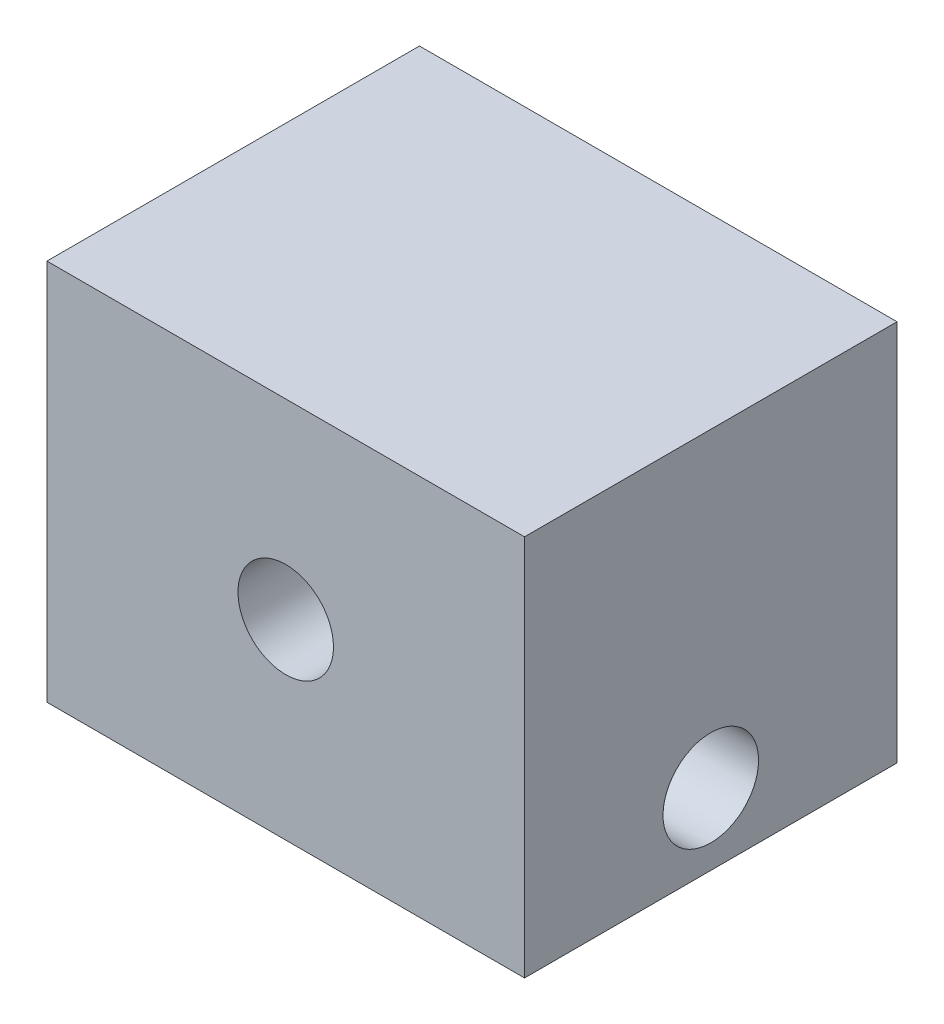
ISO-10303-21;
HEADER;
FILE_DESCRIPTION(('STEP AP214'),'2;1');
FILE_NAME('part.step','',(''),(''),'','','');
FILE_SCHEMA(('AUTOMOTIVE_DESIGN { 1 0 10303 214 1 1 1 1 }'));
ENDSEC;
DATA;
#1=APPLICATION_CONTEXT('core data for automotive mechanical design processes');
#2=APPLICATION_PROTOCOL_DEFINITION('international standard','automotive_design',2000,#1);
#3=PRODUCT_CONTEXT('',#1,'mechanical');
#4=PRODUCT('Part','Part','',(#3));
#5=PRODUCT_RELATED_PRODUCT_CATEGORY('part','',(#4));
#6=PRODUCT_DEFINITION_FORMATION('','',#4);
#7=PRODUCT_DEFINITION_CONTEXT('part definition',#1,'design');
#8=PRODUCT_DEFINITION('design','',#6,#7);
#9=PRODUCT_DEFINITION_SHAPE('','',#8);
#10=(LENGTH_UNIT() NAMED_UNIT(*) SI_UNIT(.MILLI.,.METRE.));
#11=(NAMED_UNIT(*) PLANE_ANGLE_UNIT() SI_UNIT($,.RADIAN.));
#12=(NAMED_UNIT(*) SI_UNIT($,.STERADIAN.) SOLID_ANGLE_UNIT());
#13=UNCERTAINTY_MEASURE_WITH_UNIT(LENGTH_MEASURE(1.E-05),#10,'distance_accuracy_value','');
#14=(GEOMETRIC_REPRESENTATION_CONTEXT(3) GLOBAL_UNCERTAINTY_ASSIGNED_CONTEXT((#13)) GLOBAL_UNIT_ASSIGNED_CONTEXT((#10,
#11,#12)) REPRESENTATION_CONTEXT('',''));
#15=CARTESIAN_POINT('',(0.,0.,0.));
#16=DIRECTION('',(0.,0.,1.));
#17=DIRECTION('',(1.,0.,0.));
#18=AXIS2_PLACEMENT_3D('',#15,#16,#17);
#19=CARTESIAN_POINT('',(-50.0000000000002,-25.0000000000004,-78.));
#20=DIRECTION('',(-1.,0.,0.));
#21=DIRECTION('',(0.,-1.,0.));
#22=AXIS2_PLACEMENT_3D('',#19,#20,#21);
#23=PLANE('',#22);
#24=CARTESIAN_POINT('',(-50.0000000000002,-9.99999999999998,-39.));
#25=DIRECTION('',(-1.,0.,0.));
#26=DIRECTION('',(0.,-1.,0.));
#27=AXIS2_PLACEMENT_3D('',#24,#25,#26);
#28=CIRCLE('',#27,10.);
#29=CARTESIAN_POINT('',(-50.0000000000001,-19.9999999999996,-39.));
#30=VERTEX_POINT('',#29);
#31=EDGE_CURVE('E180',#30,#30,#28,.T.);
#32=ORIENTED_EDGE('',*,*,#31,.F.);
#33=EDGE_LOOP('',(#32));
#34=FACE_BOUND('',#33,.T.);
#35=DIRECTION('',(0.,-1.,0.));
#36=VECTOR('',#35,1.);
#37=CARTESIAN_POINT('',(-50.0000000000002,-25.,0.));
#38=LINE('',#37,#36);
#39=CARTESIAN_POINT('',(-50.0000000000035,55.0000000000004,0.));
#40=VERTEX_POINT('',#39);
#41=CARTESIAN_POINT('',(-50.0000000000002,-25.,0.));
#42=VERTEX_POINT('',#41);
#43=EDGE_CURVE('E115',#40,#42,#38,.T.);
#44=ORIENTED_EDGE('',*,*,#43,.F.);
#45=DIRECTION('',(0.,0.,1.));
#46=VECTOR('',#45,1.);
#47=CARTESIAN_POINT('',(-50.0000000000035,55.0000000000004,-78.));
#48=LINE('',#47,#46);
#49=CARTESIAN_POINT('',(-50.0000000000035,55.0000000000004,-78.));
#50=VERTEX_POINT('',#49);
#51=EDGE_CURVE('E11',#50,#40,#48,.T.);
#52=ORIENTED_EDGE('',*,*,#51,.F.);
#53=DIRECTION('',(0.,-1.,0.));
#54=VECTOR('',#53,1.);
#55=CARTESIAN_POINT('',(-50.0000000000002,-25.0000000000004,-78.));
#56=LINE('',#55,#54);
#57=CARTESIAN_POINT('',(-50.0000000000002,-25.0000000000004,-78.));
#58=VERTEX_POINT('',#57);
#59=EDGE_CURVE('E103',#50,#58,#56,.T.);
#60=ORIENTED_EDGE('',*,*,#59,.T.);
#61=DIRECTION('',(0.,0.,1.));
#62=VECTOR('',#61,1.);
#63=CARTESIAN_POINT('',(-50.0000000000002,-25.0000000000004,-78.));
#64=LINE('',#63,#62);
#65=EDGE_CURVE('E44',#58,#42,#64,.T.);
#66=ORIENTED_EDGE('',*,*,#65,.T.);
#67=EDGE_LOOP('',(#44,#52,#60,#66));
#68=FACE_BOUND('',#67,.T.);
#69=ADVANCED_FACE('F41',(#34,#68),#23,.T.);
#70=CARTESIAN_POINT('',(-50.0000000000035,55.0000000000004,-78.));
#71=DIRECTION('',(0.,1.,0.));
#72=DIRECTION('',(-1.,0.,0.));
#73=AXIS2_PLACEMENT_3D('',#70,#71,#72);
#74=PLANE('',#73);
#75=DIRECTION('',(-1.,0.,0.));
#76=VECTOR('',#75,1.);
#77=CARTESIAN_POINT('',(-50.0000000000035,55.0000000000004,0.));
#78=LINE('',#77,#76);
#79=CARTESIAN_POINT('',(49.9999999999968,55.0000000000005,0.));
#80=VERTEX_POINT('',#79);
#81=EDGE_CURVE('E109',#80,#40,#78,.T.);
#82=ORIENTED_EDGE('',*,*,#81,.F.);
#83=DIRECTION('',(0.,0.,1.));
#84=VECTOR('',#83,1.);
#85=CARTESIAN_POINT('',(49.9999999999968,55.0000000000004,-78.));
#86=LINE('',#85,#84);
#87=CARTESIAN_POINT('',(49.9999999999968,55.0000000000004,-78.));
#88=VERTEX_POINT('',#87);
#89=EDGE_CURVE('E51',#88,#80,#86,.T.);
#90=ORIENTED_EDGE('',*,*,#89,.F.);
#91=DIRECTION('',(-1.,0.,0.));
#92=VECTOR('',#91,1.);
#93=CARTESIAN_POINT('',(-50.0000000000035,55.0000000000004,-78.));
#94=LINE('',#93,#92);
#95=EDGE_CURVE('E98',#88,#50,#94,.T.);
#96=ORIENTED_EDGE('',*,*,#95,.T.);
#97=ORIENTED_EDGE('',*,*,#51,.T.);
#98=EDGE_LOOP('',(#82,#90,#96,#97));
#99=FACE_BOUND('',#98,.T.);
#100=ADVANCED_FACE('F142',(#99),#74,.T.);
#101=CARTESIAN_POINT('',(49.9999999999968,55.0000000000004,-78.));
#102=DIRECTION('',(1.,0.,0.));
#103=DIRECTION('',(0.,1.,0.));
#104=AXIS2_PLACEMENT_3D('',#101,#102,#103);
#105=PLANE('',#104);
#106=CARTESIAN_POINT('',(50.0000000000002,-9.99999999999954,-39.));
#107=DIRECTION('',(1.,0.,0.));
#108=DIRECTION('',(0.,1.,0.));
#109=AXIS2_PLACEMENT_3D('',#106,#107,#108);
#110=CIRCLE('',#109,10.);
#111=CARTESIAN_POINT('',(50.0000000000002,-19.9999999999995,-39.));
#112=VERTEX_POINT('',#111);
#113=EDGE_CURVE('E177',#112,#112,#110,.F.);
#114=ORIENTED_EDGE('',*,*,#113,.T.);
#115=EDGE_LOOP('',(#114));
#116=FACE_BOUND('',#115,.T.);
#117=DIRECTION('',(0.,1.,0.));
#118=VECTOR('',#117,1.);
#119=CARTESIAN_POINT('',(49.9999999999968,55.0000000000005,0.));
#120=LINE('',#119,#118);
#121=CARTESIAN_POINT('',(50.0000000000002,-25.,0.));
#122=VERTEX_POINT('',#121);
#123=EDGE_CURVE('E92',#122,#80,#120,.T.);
#124=ORIENTED_EDGE('',*,*,#123,.F.);
#125=DIRECTION('',(0.,0.,1.));
#126=VECTOR('',#125,1.);
#127=CARTESIAN_POINT('',(50.0000000000002,-24.9999999999995,-78.));
#128=LINE('',#127,#126);
#129=CARTESIAN_POINT('',(50.0000000000002,-24.9999999999995,-78.));
#130=VERTEX_POINT('',#129);
#131=EDGE_CURVE('E87',#130,#122,#128,.T.);
#132=ORIENTED_EDGE('',*,*,#131,.F.);
#133=DIRECTION('',(0.,1.,0.));
#134=VECTOR('',#133,1.);
#135=CARTESIAN_POINT('',(49.9999999999968,55.0000000000004,-78.));
#136=LINE('',#135,#134);
#137=EDGE_CURVE('E90',#130,#88,#136,.T.);
#138=ORIENTED_EDGE('',*,*,#137,.T.);
#139=ORIENTED_EDGE('',*,*,#89,.T.);
#140=EDGE_LOOP('',(#124,#132,#138,#139));
#141=FACE_BOUND('',#140,.T.);
#142=ADVANCED_FACE('F89',(#116,#141),#105,.T.);
#143=CARTESIAN_POINT('',(50.0000000000002,-24.9999999999995,-78.));
#144=DIRECTION('',(0.,-1.,0.));
#145=DIRECTION('',(1.,0.,0.));
#146=AXIS2_PLACEMENT_3D('',#143,#144,#145);
#147=PLANE('',#146);
#148=DIRECTION('',(1.,0.,0.));
#149=VECTOR('',#148,1.);
#150=CARTESIAN_POINT('',(50.0000000000002,-25.,0.));
#151=LINE('',#150,#149);
#152=EDGE_CURVE('E119',#42,#122,#151,.T.);
#153=ORIENTED_EDGE('',*,*,#152,.F.);
#154=ORIENTED_EDGE('',*,*,#65,.F.);
#155=DIRECTION('',(1.,0.,0.));
#156=VECTOR('',#155,1.);
#157=CARTESIAN_POINT('',(50.0000000000002,-24.9999999999995,-78.));
#158=LINE('',#157,#156);
#159=EDGE_CURVE('E97',#58,#130,#158,.T.);
#160=ORIENTED_EDGE('',*,*,#159,.T.);
#161=ORIENTED_EDGE('',*,*,#131,.T.);
#162=EDGE_LOOP('',(#153,#154,#160,#161));
#163=FACE_BOUND('',#162,.T.);
#164=ADVANCED_FACE('F101',(#163),#147,.T.);
#165=CARTESIAN_POINT('',(0.,4.16333634234434E-13,-78.));
#166=DIRECTION('',(0.,0.,-1.));
#167=DIRECTION('',(-1.,0.,0.));
#168=AXIS2_PLACEMENT_3D('',#165,#166,#167);
#169=PLANE('',#168);
#170=CARTESIAN_POINT('',(0.,15.0000000000004,-78.));
#171=DIRECTION('',(0.,0.,1.));
#172=DIRECTION('',(1.,0.,0.));
#173=AXIS2_PLACEMENT_3D('',#170,#171,#172);
#174=CIRCLE('',#173,10.);
#175=CARTESIAN_POINT('',(10.,15.0000000000004,-78.));
#176=VERTEX_POINT('',#175);
#177=EDGE_CURVE('E120',#176,#176,#174,.T.);
#178=ORIENTED_EDGE('',*,*,#177,.T.);
#179=EDGE_LOOP('',(#178));
#180=FACE_BOUND('',#179,.T.);
#181=ORIENTED_EDGE('',*,*,#59,.F.);
#182=ORIENTED_EDGE('',*,*,#95,.F.);
#183=ORIENTED_EDGE('',*,*,#137,.F.);
#184=ORIENTED_EDGE('',*,*,#159,.F.);
#185=EDGE_LOOP('',(#181,#182,#183,#184));
#186=FACE_BOUND('',#185,.T.);
#187=ADVANCED_FACE('F96',(#180,#186),#169,.T.);
#188=CARTESIAN_POINT('',(0.,0.,0.));
#189=DIRECTION('',(0.,0.,-1.));
#190=DIRECTION('',(-1.,0.,0.));
#191=AXIS2_PLACEMENT_3D('',#188,#189,#190);
#192=PLANE('',#191);
#193=CARTESIAN_POINT('',(0.,15.,0.));
#194=DIRECTION('',(0.,0.,1.));
#195=DIRECTION('',(1.,0.,0.));
#196=AXIS2_PLACEMENT_3D('',#193,#194,#195);
#197=CIRCLE('',#196,10.);
#198=CARTESIAN_POINT('',(10.,15.,0.));
#199=VERTEX_POINT('',#198);
#200=EDGE_CURVE('E182',#199,#199,#197,.T.);
#201=ORIENTED_EDGE('',*,*,#200,.F.);
#202=EDGE_LOOP('',(#201));
#203=FACE_BOUND('',#202,.T.);
#204=ORIENTED_EDGE('',*,*,#43,.T.);
#205=ORIENTED_EDGE('',*,*,#152,.T.);
#206=ORIENTED_EDGE('',*,*,#123,.T.);
#207=ORIENTED_EDGE('',*,*,#81,.T.);
#208=EDGE_LOOP('',(#204,#205,#206,#207));
#209=FACE_BOUND('',#208,.T.);
#210=ADVANCED_FACE('F141',(#203,#209),#192,.F.);
#211=CARTESIAN_POINT('',(0.,15.0000000000004,-78.));
#212=DIRECTION('',(0.,0.,1.));
#213=DIRECTION('',(1.,0.,0.));
#214=AXIS2_PLACEMENT_3D('',#211,#212,#213);
#215=CYLINDRICAL_SURFACE('',#214,10.);
#216=ORIENTED_EDGE('',*,*,#177,.F.);
#217=EDGE_LOOP('',(#216));
#218=FACE_BOUND('',#217,.T.);
#219=ORIENTED_EDGE('',*,*,#200,.T.);
#220=EDGE_LOOP('',(#219));
#221=FACE_BOUND('',#220,.T.);
#222=ADVANCED_FACE('F162',(#218,#221),#215,.F.);
#223=CARTESIAN_POINT('',(50.0010000000002,-9.99999999999954,-39.));
#224=DIRECTION('',(-1.,0.,0.));
#225=DIRECTION('',(0.,-1.,0.));
#226=AXIS2_PLACEMENT_3D('',#223,#224,#225);
#227=CYLINDRICAL_SURFACE('',#226,10.);
#228=CARTESIAN_POINT('',(50.0000000000002,-19.9999999999995,-39.));
#229=CARTESIAN_POINT('',(48.9583333333335,-19.9999999999995,-39.));
#230=CARTESIAN_POINT('',(47.9166666666668,-19.9999999999995,-39.));
#231=CARTESIAN_POINT('',(45.8333333333335,-19.9999999999995,-39.));
#232=CARTESIAN_POINT('',(44.7916666666668,-19.9999999999995,-39.));
#233=CARTESIAN_POINT('',(42.7083333333335,-19.9999999999995,-39.));
#234=CARTESIAN_POINT('',(41.6666666666668,-19.9999999999995,-39.));
#235=CARTESIAN_POINT('',(39.5833333333335,-19.9999999999995,-39.));
#236=CARTESIAN_POINT('',(38.5416666666668,-19.9999999999995,-39.));
#237=CARTESIAN_POINT('',(36.4583333333335,-19.9999999999995,-39.));
#238=CARTESIAN_POINT('',(35.4166666666668,-19.9999999999995,-39.));
#239=CARTESIAN_POINT('',(33.3333333333334,-19.9999999999995,-39.));
#240=CARTESIAN_POINT('',(32.2916666666668,-19.9999999999995,-39.));
#241=CARTESIAN_POINT('',(30.2083333333334,-19.9999999999995,-39.));
#242=CARTESIAN_POINT('',(29.1666666666668,-19.9999999999995,-39.));
#243=CARTESIAN_POINT('',(27.0833333333334,-19.9999999999995,-39.));
#244=CARTESIAN_POINT('',(26.0416666666668,-19.9999999999995,-39.));
#245=CARTESIAN_POINT('',(23.9583333333334,-19.9999999999995,-39.));
#246=CARTESIAN_POINT('',(22.9166666666667,-19.9999999999995,-39.));
#247=CARTESIAN_POINT('',(20.8333333333334,-19.9999999999995,-39.));
#248=CARTESIAN_POINT('',(19.7916666666667,-19.9999999999995,-39.));
#249=CARTESIAN_POINT('',(17.7083333333334,-19.9999999999995,-39.));
#250=CARTESIAN_POINT('',(16.6666666666667,-19.9999999999995,-39.));
#251=CARTESIAN_POINT('',(14.5833333333334,-19.9999999999995,-39.));
#252=CARTESIAN_POINT('',(13.5416666666667,-19.9999999999995,-39.));
#253=CARTESIAN_POINT('',(11.4583333333334,-19.9999999999995,-39.));
#254=CARTESIAN_POINT('',(10.4166666666667,-19.9999999999995,-39.));
#255=CARTESIAN_POINT('',(8.33333333333337,-19.9999999999995,-39.));
#256=CARTESIAN_POINT('',(7.2916666666667,-19.9999999999995,-39.));
#257=CARTESIAN_POINT('',(5.20833333333336,-19.9999999999995,-39.));
#258=CARTESIAN_POINT('',(4.16666666666669,-19.9999999999995,-39.));
#259=CARTESIAN_POINT('',(2.08333333333335,-19.9999999999995,-39.));
#260=CARTESIAN_POINT('',(1.04166666666668,-19.9999999999995,-39.));
#261=CARTESIAN_POINT('',(-1.04166666666666,-19.9999999999995,-39.));
#262=CARTESIAN_POINT('',(-2.08333333333333,-19.9999999999995,-39.));
#263=CARTESIAN_POINT('',(-4.16666666666667,-19.9999999999995,-39.));
#264=CARTESIAN_POINT('',(-5.20833333333334,-19.9999999999995,-39.));
#265=CARTESIAN_POINT('',(-7.29166666666668,-19.9999999999995,-39.));
#266=CARTESIAN_POINT('',(-8.33333333333335,-19.9999999999995,-39.));
#267=CARTESIAN_POINT('',(-10.4166666666667,-19.9999999999995,-39.));
#268=CARTESIAN_POINT('',(-11.4583333333334,-19.9999999999995,-39.));
#269=CARTESIAN_POINT('',(-13.5416666666667,-19.9999999999995,-39.));
#270=CARTESIAN_POINT('',(-14.5833333333334,-19.9999999999995,-39.));
#271=CARTESIAN_POINT('',(-16.6666666666667,-19.9999999999995,-39.));
#272=CARTESIAN_POINT('',(-17.7083333333334,-19.9999999999995,-39.));
#273=CARTESIAN_POINT('',(-19.7916666666667,-19.9999999999995,-39.));
#274=CARTESIAN_POINT('',(-20.8333333333334,-19.9999999999996,-39.));
#275=CARTESIAN_POINT('',(-22.9166666666667,-19.9999999999996,-39.));
#276=CARTESIAN_POINT('',(-23.9583333333334,-19.9999999999996,-39.));
#277=CARTESIAN_POINT('',(-26.0416666666667,-19.9999999999996,-39.));
#278=CARTESIAN_POINT('',(-27.0833333333334,-19.9999999999996,-39.));
#279=CARTESIAN_POINT('',(-29.1666666666667,-19.9999999999996,-39.));
#280=CARTESIAN_POINT('',(-30.2083333333334,-19.9999999999996,-39.));
#281=CARTESIAN_POINT('',(-32.2916666666668,-19.9999999999996,-39.));
#282=CARTESIAN_POINT('',(-33.3333333333334,-19.9999999999996,-39.));
#283=CARTESIAN_POINT('',(-35.4166666666668,-19.9999999999996,-39.));
#284=CARTESIAN_POINT('',(-36.4583333333334,-19.9999999999996,-39.));
#285=CARTESIAN_POINT('',(-38.5416666666668,-19.9999999999996,-39.));
#286=CARTESIAN_POINT('',(-39.5833333333334,-19.9999999999996,-39.));
#287=CARTESIAN_POINT('',(-41.6666666666668,-19.9999999999996,-39.));
#288=CARTESIAN_POINT('',(-42.7083333333334,-19.9999999999996,-39.));
#289=CARTESIAN_POINT('',(-44.7916666666668,-19.9999999999996,-39.));
#290=CARTESIAN_POINT('',(-45.8333333333335,-19.9999999999996,-39.));
#291=CARTESIAN_POINT('',(-47.9166666666668,-19.9999999999996,-39.));
#292=CARTESIAN_POINT('',(-48.9583333333335,-19.9999999999996,-39.));
#293=CARTESIAN_POINT('',(-50.0000000000001,-19.9999999999996,-39.));
#294=B_SPLINE_CURVE_WITH_KNOTS('',3,(#228,#229,#230,#231,#232,#233,#234,#235,#236,#237,#238,
#239,#240,#241,#242,#243,#244,#245,#246,#247,#248,#249,#250,#251,#252,#253,#254,#255,#256,#257,
#258,#259,#260,#261,#262,#263,#264,#265,#266,#267,#268,#269,#270,#271,#272,#273,#274,#275,#276,
#277,#278,#279,#280,#281,#282,#283,#284,#285,#286,#287,#288,#289,#290,#291,#292,#293),
.UNSPECIFIED.,.F.,.F.,(4,2,2,2,2,2,2,2,2,2,2,2,2,2,2,2,2,2,2,2,2,2,2,2,2,2,2,2,2,2,2,2,4),(0.,
3.12500000000001,6.25000000000002,9.37500000000003,12.5,15.625,18.7500000000001,
21.8750000000001,25.0000000000001,28.1250000000001,31.2500000000001,34.3750000000001,
37.5000000000001,40.6250000000001,43.7500000000001,46.8750000000001,50.0000000000002,
53.1250000000002,56.2500000000002,59.3750000000002,62.5000000000002,65.6250000000002,
68.7500000000002,71.8750000000002,75.0000000000002,78.1250000000003,81.2500000000003,
84.3750000000003,87.5000000000003,90.6250000000003,93.7500000000003,96.8750000000003,100.),.UNSPECIFIED.);
#295=EDGE_CURVE('BSEAM168',#112,#30,#294,.T.);
#296=ORIENTED_EDGE('',*,*,#113,.F.);
#297=ORIENTED_EDGE('',*,*,#31,.T.);
#298=ORIENTED_EDGE('',*,*,#295,.T.);
#299=ORIENTED_EDGE('',*,*,#295,.F.);
#300=EDGE_LOOP('',(#296,#298,#297,#299));
#301=FACE_BOUND('',#300,.T.);
#302=ADVANCED_FACE('F168',(#301),#227,.F.);
#303=CLOSED_SHELL('',(#69,#100,#142,#164,#187,#210,#222,#302));
#304=MANIFOLD_SOLID_BREP('B2',#303);
#305=ADVANCED_BREP_SHAPE_REPRESENTATION('',(#18,#304),#14);
#306=SHAPE_DEFINITION_REPRESENTATION(#9,#305);
ENDSEC;
END-ISO-10303-21;
